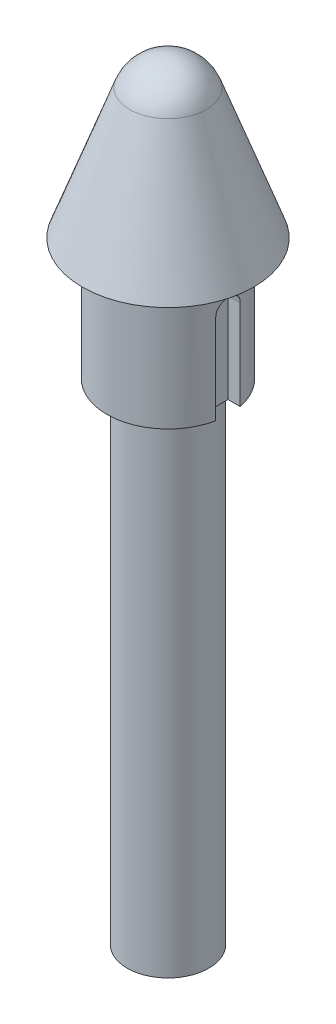
ISO-10303-21;
HEADER;
FILE_DESCRIPTION(('STEP AP214'),'2;1');
FILE_NAME('part.step','',(''),(''),'','','');
FILE_SCHEMA(('AUTOMOTIVE_DESIGN { 1 0 10303 214 1 1 1 1 }'));
ENDSEC;
DATA;
#1=APPLICATION_CONTEXT('core data for automotive mechanical design processes');
#2=APPLICATION_PROTOCOL_DEFINITION('international standard','automotive_design',2000,#1);
#3=PRODUCT_CONTEXT('',#1,'mechanical');
#4=PRODUCT('Part','Part','',(#3));
#5=PRODUCT_RELATED_PRODUCT_CATEGORY('part','',(#4));
#6=PRODUCT_DEFINITION_FORMATION('','',#4);
#7=PRODUCT_DEFINITION_CONTEXT('part definition',#1,'design');
#8=PRODUCT_DEFINITION('design','',#6,#7);
#9=PRODUCT_DEFINITION_SHAPE('','',#8);
#10=(LENGTH_UNIT() NAMED_UNIT(*) SI_UNIT(.MILLI.,.METRE.));
#11=(NAMED_UNIT(*) PLANE_ANGLE_UNIT() SI_UNIT($,.RADIAN.));
#12=(NAMED_UNIT(*) SI_UNIT($,.STERADIAN.) SOLID_ANGLE_UNIT());
#13=UNCERTAINTY_MEASURE_WITH_UNIT(LENGTH_MEASURE(1.E-05),#10,'distance_accuracy_value','');
#14=(GEOMETRIC_REPRESENTATION_CONTEXT(3) GLOBAL_UNCERTAINTY_ASSIGNED_CONTEXT((#13)) GLOBAL_UNIT_ASSIGNED_CONTEXT((#10,
#11,#12)) REPRESENTATION_CONTEXT('',''));
#15=CARTESIAN_POINT('',(0.,0.,0.));
#16=DIRECTION('',(0.,0.,1.));
#17=DIRECTION('',(1.,0.,0.));
#18=AXIS2_PLACEMENT_3D('',#15,#16,#17);
#19=CARTESIAN_POINT('',(0.,-55.,0.));
#20=DIRECTION('',(0.,-1.,0.));
#21=DIRECTION('',(0.,0.,-1.));
#22=AXIS2_PLACEMENT_3D('',#19,#20,#21);
#23=CYLINDRICAL_SURFACE('',#22,15.);
#24=CARTESIAN_POINT('',(14.6969384566991,-8.,3.));
#25=CARTESIAN_POINT('',(14.6969312234392,-7.91652066508534,3.00000906544191));
#26=CARTESIAN_POINT('',(14.6976495486021,-7.8330463350397,2.9965157041537));
#27=CARTESIAN_POINT('',(14.700483757429,-7.66671185235168,2.98259444138147));
#28=CARTESIAN_POINT('',(14.702599468061,-7.58385162495212,2.97216739846318));
#29=CARTESIAN_POINT('',(14.7081705090494,-7.41945853907751,2.94447095338817));
#30=CARTESIAN_POINT('',(14.7116237172869,-7.33792379002333,2.92721238940545));
#31=CARTESIAN_POINT('',(14.7197625010775,-7.17664875253507,2.88600576139186));
#32=CARTESIAN_POINT('',(14.7244480815889,-7.09690847132229,2.86205767044614));
#33=CARTESIAN_POINT('',(14.7401629599102,-6.86119639665705,2.78041602247391));
#34=CARTESIAN_POINT('',(14.7528550210328,-6.70860603613304,2.71290347005579));
#35=CARTESIAN_POINT('',(14.7812316708001,-6.41697632811339,2.55375802161833));
#36=CARTESIAN_POINT('',(14.7969166493193,-6.27793874964937,2.4621219825451));
#37=CARTESIAN_POINT('',(14.8297578363449,-6.0153317075264,2.2559454155559));
#38=CARTESIAN_POINT('',(14.8469300180427,-5.89197791009017,2.14113225771899));
#39=CARTESIAN_POINT('',(14.8806722679768,-5.66613761672948,1.89243469094566));
#40=CARTESIAN_POINT('',(14.8972422219552,-5.56365506380758,1.75854668648769));
#41=CARTESIAN_POINT('',(14.9280884957243,-5.38160918594931,1.47404497162895));
#42=CARTESIAN_POINT('',(14.9423429244798,-5.30225953850813,1.32329209339517));
#43=CARTESIAN_POINT('',(14.966758768645,-5.17014026330807,1.01029658203994));
#44=CARTESIAN_POINT('',(14.9769230545326,-5.11735198813824,0.848062101105301));
#45=CARTESIAN_POINT('',(14.98955535506,-5.05255559545008,0.570758604929492));
#46=CARTESIAN_POINT('',(14.9934509072789,-5.03287056601478,0.457488931874396));
#47=CARTESIAN_POINT('',(14.9986822110839,-5.00658841680157,0.229497779189883));
#48=CARTESIAN_POINT('',(15.0000204862012,-4.99997839432807,0.114777843364462));
#49=CARTESIAN_POINT('',(15.,-5.,0.));
#50=B_SPLINE_CURVE_WITH_KNOTS('',3,(#24,#25,#26,#27,#28,#29,#30,#31,#32,#33,#34,#35,#36,#37,#38,
#39,#40,#41,#42,#43,#44,#45,#46,#47,#48,#49),.UNSPECIFIED.,.F.,.F.,(4,2,2,2,2,2,2,2,2,2,2,2,4),
(0.,0.25035310738077,0.500675220464686,0.750601780324507,1.00052934576068,1.50000163080435,
1.999539024427,2.50533619405173,3.01122883058791,3.52165618091723,4.0317246839953,
4.37609006946685,4.72011545796362),.UNSPECIFIED.);
#51=CARTESIAN_POINT('',(14.6969384566991,-8.,3.));
#52=VERTEX_POINT('',#51);
#53=CARTESIAN_POINT('',(15.,-5.,0.));
#54=VERTEX_POINT('',#53);
#55=EDGE_CURVE('E45',#52,#54,#50,.T.);
#56=ORIENTED_EDGE('',*,*,#55,.T.);
#57=CARTESIAN_POINT('',(15.,-5.,0.));
#58=CARTESIAN_POINT('',(15.0000066839147,-4.99999097484375,-0.0834962437043639));
#59=CARTESIAN_POINT('',(14.9993029840755,-5.00348571142423,-0.166987576943416));
#60=CARTESIAN_POINT('',(14.996524313953,-5.01741274370686,-0.333357023806804));
#61=CARTESIAN_POINT('',(14.9944495062925,-5.02784421666549,-0.416235208976033));
#62=CARTESIAN_POINT('',(14.9889823330591,-5.05555331233057,-0.58066760305922));
#63=CARTESIAN_POINT('',(14.9855920132132,-5.07282030609371,-0.662223663834627));
#64=CARTESIAN_POINT('',(14.9775937585775,-5.11404787064147,-0.82354159535056));
#65=CARTESIAN_POINT('',(14.9729858204522,-5.13800845976239,-0.903303461175461));
#66=CARTESIAN_POINT('',(14.9575127234102,-5.21969545895455,-1.13908352103716));
#67=CARTESIAN_POINT('',(14.9449939021987,-5.28724805048632,-1.29171954615577));
#68=CARTESIAN_POINT('',(14.9169140352558,-5.44648708187603,-1.58342468587382));
#69=CARTESIAN_POINT('',(14.9013526392281,-5.53817630104242,-1.72249223554766));
#70=CARTESIAN_POINT('',(14.8686661547509,-5.7444070418772,-1.98506539980008));
#71=CARTESIAN_POINT('',(14.8515245643196,-5.85920921517265,-2.10836458648659));
#72=CARTESIAN_POINT('',(14.8177274041416,-6.10786227893127,-2.33409955733193));
#73=CARTESIAN_POINT('',(14.8010719330756,-6.2417170050376,-2.43653113032116));
#74=CARTESIAN_POINT('',(14.7699685399571,-6.52618833079427,-2.61852244163876));
#75=CARTESIAN_POINT('',(14.7555427056002,-6.67694990138056,-2.69785946156334));
#76=CARTESIAN_POINT('',(14.7307811722667,-6.9899628879115,-2.82995241342783));
#77=CARTESIAN_POINT('',(14.7204425461247,-7.15220598250986,-2.88272737593346));
#78=CARTESIAN_POINT('',(14.707584180765,-7.42947298813945,-2.9474871972406));
#79=CARTESIAN_POINT('',(14.703615100174,-7.54269449056358,-2.96715578638696));
#80=CARTESIAN_POINT('',(14.6982823799664,-7.77059222196287,-2.99341673810329));
#81=CARTESIAN_POINT('',(14.6969162316135,-7.88526694286319,-3.00002169179103));
#82=CARTESIAN_POINT('',(14.6969384566991,-8.,-3.));
#83=B_SPLINE_CURVE_WITH_KNOTS('',3,(#57,#58,#59,#60,#61,#62,#63,#64,#65,#66,#67,#68,#69,#70,#71,
#72,#73,#74,#75,#76,#77,#78,#79,#80,#81,#82),.UNSPECIFIED.,.F.,.F.,(4,2,2,2,2,2,2,2,2,2,2,2,4),
(0.,0.250404065586866,0.500778436866196,0.750765006342761,1.00075226063379,1.50035586182189,
2.00001701704666,2.505665088188,3.01141510031276,3.5218920779889,4.03200279849589,
4.37622496898429,4.72011520598592),.UNSPECIFIED.);
#84=CARTESIAN_POINT('',(14.6969384566991,-8.,-3.));
#85=VERTEX_POINT('',#84);
#86=EDGE_CURVE('E11',#54,#85,#83,.T.);
#87=ORIENTED_EDGE('',*,*,#86,.T.);
#88=DIRECTION('',(0.,-1.,0.));
#89=VECTOR('',#88,1.);
#90=CARTESIAN_POINT('',(14.6969384566991,-5.,-3.));
#91=LINE('',#90,#89);
#92=CARTESIAN_POINT('',(14.6969384566991,-30.,-3.));
#93=VERTEX_POINT('',#92);
#94=EDGE_CURVE('E108',#85,#93,#91,.T.);
#95=ORIENTED_EDGE('',*,*,#94,.T.);
#96=CARTESIAN_POINT('',(0.,-30.,0.));
#97=DIRECTION('',(0.,1.,0.));
#98=DIRECTION('',(0.,0.,1.));
#99=AXIS2_PLACEMENT_3D('',#96,#97,#98);
#100=CIRCLE('',#99,15.);
#101=CARTESIAN_POINT('',(14.6969384566991,-30.,3.));
#102=VERTEX_POINT('',#101);
#103=EDGE_CURVE('E110',#93,#102,#100,.T.);
#104=ORIENTED_EDGE('',*,*,#103,.T.);
#105=DIRECTION('',(0.,-1.,0.));
#106=VECTOR('',#105,1.);
#107=CARTESIAN_POINT('',(14.6969384566991,-5.,3.));
#108=LINE('',#107,#106);
#109=EDGE_CURVE('E92',#52,#102,#108,.T.);
#110=ORIENTED_EDGE('',*,*,#109,.F.);
#111=EDGE_LOOP('',(#56,#87,#95,#104,#110));
#112=FACE_BOUND('',#111,.T.);
#113=CARTESIAN_POINT('',(0.,0.,0.));
#114=DIRECTION('',(0.,-1.,0.));
#115=DIRECTION('',(0.,0.,-1.));
#116=AXIS2_PLACEMENT_3D('',#113,#114,#115);
#117=CIRCLE('',#116,15.);
#118=CARTESIAN_POINT('',(0.,0.,-15.));
#119=VERTEX_POINT('',#118);
#120=EDGE_CURVE('E120',#119,#119,#117,.T.);
#121=ORIENTED_EDGE('',*,*,#120,.T.);
#122=EDGE_LOOP('',(#121));
#123=FACE_BOUND('',#122,.T.);
#124=ADVANCED_FACE('F35',(#112,#123),#23,.T.);
#125=CARTESIAN_POINT('',(0.,28.4589818069161,0.));
#126=DIRECTION('',(0.,-1.,0.));
#127=DIRECTION('',(1.,0.,0.));
#128=AXIS2_PLACEMENT_3D('',#125,#126,#127);
#129=SPHERICAL_SURFACE('',#128,10.);
#130=CARTESIAN_POINT('',(0.,31.8791832401728,0.));
#131=DIRECTION('',(0.,-1.,0.));
#132=DIRECTION('',(0.,0.,-1.));
#133=AXIS2_PLACEMENT_3D('',#130,#131,#132);
#134=CIRCLE('',#133,9.39692620785908);
#135=CARTESIAN_POINT('',(0.,31.8791832401728,-9.39692620785908));
#136=VERTEX_POINT('',#135);
#137=EDGE_CURVE('E126',#136,#136,#134,.T.);
#138=ORIENTED_EDGE('',*,*,#137,.F.);
#139=EDGE_LOOP('',(#138));
#140=FACE_BOUND('',#139,.T.);
#141=ADVANCED_FACE('F150',(#140),#129,.T.);
#142=CARTESIAN_POINT('',(0.,0.,0.));
#143=DIRECTION('',(0.,-1.,0.));
#144=DIRECTION('',(0.,0.,-1.));
#145=AXIS2_PLACEMENT_3D('',#142,#143,#144);
#146=CONICAL_SURFACE('',#145,21.,0.349065850398867);
#147=ORIENTED_EDGE('',*,*,#137,.T.);
#148=EDGE_LOOP('',(#147));
#149=FACE_BOUND('',#148,.T.);
#150=CARTESIAN_POINT('',(0.,0.,0.));
#151=DIRECTION('',(0.,-1.,0.));
#152=DIRECTION('',(0.,0.,-1.));
#153=AXIS2_PLACEMENT_3D('',#150,#151,#152);
#154=CIRCLE('',#153,21.);
#155=CARTESIAN_POINT('',(0.,0.,-21.));
#156=VERTEX_POINT('',#155);
#157=EDGE_CURVE('E123',#156,#156,#154,.T.);
#158=ORIENTED_EDGE('',*,*,#157,.F.);
#159=EDGE_LOOP('',(#158));
#160=FACE_BOUND('',#159,.T.);
#161=ADVANCED_FACE('F158',(#149,#160),#146,.T.);
#162=CARTESIAN_POINT('',(15.,0.,0.));
#163=DIRECTION('',(0.,-1.,0.));
#164=DIRECTION('',(0.,0.,-1.));
#165=AXIS2_PLACEMENT_3D('',#162,#163,#164);
#166=PLANE('',#165);
#167=ORIENTED_EDGE('',*,*,#157,.T.);
#168=EDGE_LOOP('',(#167));
#169=FACE_BOUND('',#168,.T.);
#170=ORIENTED_EDGE('',*,*,#120,.F.);
#171=EDGE_LOOP('',(#170));
#172=FACE_BOUND('',#171,.T.);
#173=ADVANCED_FACE('F153',(#169,#172),#166,.T.);
#174=CARTESIAN_POINT('',(0.,9.42117093025151,0.));
#175=DIRECTION('',(0.,1.,0.));
#176=DIRECTION('',(0.,0.,1.));
#177=AXIS2_PLACEMENT_3D('',#174,#175,#176);
#178=CYLINDRICAL_SURFACE('',#177,10.);
#179=CARTESIAN_POINT('',(0.,-150.,0.));
#180=DIRECTION('',(0.,1.,0.));
#181=DIRECTION('',(0.,0.,1.));
#182=AXIS2_PLACEMENT_3D('',#179,#180,#181);
#183=CIRCLE('',#182,10.);
#184=CARTESIAN_POINT('',(0.,-150.,10.));
#185=VERTEX_POINT('',#184);
#186=EDGE_CURVE('E117',#185,#185,#183,.T.);
#187=ORIENTED_EDGE('',*,*,#186,.T.);
#188=EDGE_LOOP('',(#187));
#189=FACE_BOUND('',#188,.T.);
#190=CARTESIAN_POINT('',(0.,-30.,0.));
#191=DIRECTION('',(0.,1.,0.));
#192=DIRECTION('',(0.,0.,1.));
#193=AXIS2_PLACEMENT_3D('',#190,#191,#192);
#194=CIRCLE('',#193,10.);
#195=CARTESIAN_POINT('',(0.,-30.,10.));
#196=VERTEX_POINT('',#195);
#197=EDGE_CURVE('E114',#196,#196,#194,.T.);
#198=ORIENTED_EDGE('',*,*,#197,.F.);
#199=EDGE_LOOP('',(#198));
#200=FACE_BOUND('',#199,.T.);
#201=ADVANCED_FACE('F157',(#189,#200),#178,.T.);
#202=CARTESIAN_POINT('',(15.,-30.,0.));
#203=DIRECTION('',(0.,-1.,0.));
#204=DIRECTION('',(0.,0.,-1.));
#205=AXIS2_PLACEMENT_3D('',#202,#203,#204);
#206=PLANE('',#205);
#207=DIRECTION('',(1.,0.,0.));
#208=VECTOR('',#207,1.);
#209=CARTESIAN_POINT('',(11.6969384566991,-30.,-3.));
#210=LINE('',#209,#208);
#211=CARTESIAN_POINT('',(11.6969384566991,-30.,-3.));
#212=VERTEX_POINT('',#211);
#213=EDGE_CURVE('E104',#212,#93,#210,.T.);
#214=ORIENTED_EDGE('',*,*,#213,.F.);
#215=DIRECTION('',(0.,0.,-1.));
#216=VECTOR('',#215,1.);
#217=CARTESIAN_POINT('',(11.6969384566991,-30.,3.));
#218=LINE('',#217,#216);
#219=CARTESIAN_POINT('',(11.6969384566991,-30.,3.));
#220=VERTEX_POINT('',#219);
#221=EDGE_CURVE('E84',#220,#212,#218,.T.);
#222=ORIENTED_EDGE('',*,*,#221,.F.);
#223=DIRECTION('',(-1.,0.,0.));
#224=VECTOR('',#223,1.);
#225=CARTESIAN_POINT('',(14.6969384566991,-30.,3.));
#226=LINE('',#225,#224);
#227=EDGE_CURVE('E95',#102,#220,#226,.T.);
#228=ORIENTED_EDGE('',*,*,#227,.F.);
#229=ORIENTED_EDGE('',*,*,#103,.F.);
#230=EDGE_LOOP('',(#214,#222,#228,#229));
#231=FACE_BOUND('',#230,.T.);
#232=ORIENTED_EDGE('',*,*,#197,.T.);
#233=EDGE_LOOP('',(#232));
#234=FACE_BOUND('',#233,.T.);
#235=ADVANCED_FACE('F101',(#231,#234),#206,.T.);
#236=CARTESIAN_POINT('',(0.,-150.,0.));
#237=DIRECTION('',(0.,-1.,0.));
#238=DIRECTION('',(0.,0.,-1.));
#239=AXIS2_PLACEMENT_3D('',#236,#237,#238);
#240=PLANE('',#239);
#241=ORIENTED_EDGE('',*,*,#186,.F.);
#242=EDGE_LOOP('',(#241));
#243=FACE_BOUND('',#242,.T.);
#244=ADVANCED_FACE('F151',(#243),#240,.T.);
#245=CARTESIAN_POINT('',(11.6969384566991,-5.,-3.));
#246=DIRECTION('',(0.,0.,-1.));
#247=DIRECTION('',(-1.,0.,0.));
#248=AXIS2_PLACEMENT_3D('',#245,#246,#247);
#249=PLANE('',#248);
#250=ORIENTED_EDGE('',*,*,#94,.F.);
#251=DIRECTION('',(1.,0.,0.));
#252=VECTOR('',#251,1.);
#253=CARTESIAN_POINT('',(11.6969384566991,-8.,-3.));
#254=LINE('',#253,#252);
#255=CARTESIAN_POINT('',(11.6969384566991,-8.,-3.));
#256=VERTEX_POINT('',#255);
#257=EDGE_CURVE('E134',#85,#256,#254,.F.);
#258=ORIENTED_EDGE('',*,*,#257,.T.);
#259=DIRECTION('',(0.,-1.,0.));
#260=VECTOR('',#259,1.);
#261=CARTESIAN_POINT('',(11.6969384566991,-5.,-3.));
#262=LINE('',#261,#260);
#263=EDGE_CURVE('E91',#256,#212,#262,.T.);
#264=ORIENTED_EDGE('',*,*,#263,.T.);
#265=ORIENTED_EDGE('',*,*,#213,.T.);
#266=EDGE_LOOP('',(#250,#258,#264,#265));
#267=FACE_BOUND('',#266,.T.);
#268=ADVANCED_FACE('F188',(#267),#249,.F.);
#269=CARTESIAN_POINT('',(11.6969384566991,-5.,3.));
#270=DIRECTION('',(-1.,0.,0.));
#271=DIRECTION('',(0.,0.,1.));
#272=AXIS2_PLACEMENT_3D('',#269,#270,#271);
#273=PLANE('',#272);
#274=CARTESIAN_POINT('',(11.6969384566991,-8.,0.));
#275=DIRECTION('',(-1.,0.,0.));
#276=DIRECTION('',(0.,0.,1.));
#277=AXIS2_PLACEMENT_3D('',#274,#275,#276);
#278=CIRCLE('',#277,3.);
#279=CARTESIAN_POINT('',(11.6969384566991,-5.,0.));
#280=VERTEX_POINT('',#279);
#281=EDGE_CURVE('E129',#256,#280,#278,.F.);
#282=ORIENTED_EDGE('',*,*,#281,.T.);
#283=CARTESIAN_POINT('',(11.6969384566991,-8.,0.));
#284=DIRECTION('',(-1.,0.,0.));
#285=DIRECTION('',(0.,0.,1.));
#286=AXIS2_PLACEMENT_3D('',#283,#284,#285);
#287=CIRCLE('',#286,3.);
#288=CARTESIAN_POINT('',(11.6969384566991,-8.,3.));
#289=VERTEX_POINT('',#288);
#290=EDGE_CURVE('E87',#280,#289,#287,.F.);
#291=ORIENTED_EDGE('',*,*,#290,.T.);
#292=DIRECTION('',(0.,-1.,0.));
#293=VECTOR('',#292,1.);
#294=CARTESIAN_POINT('',(11.6969384566991,-5.,3.));
#295=LINE('',#294,#293);
#296=EDGE_CURVE('E79',#289,#220,#295,.T.);
#297=ORIENTED_EDGE('',*,*,#296,.T.);
#298=ORIENTED_EDGE('',*,*,#221,.T.);
#299=ORIENTED_EDGE('',*,*,#263,.F.);
#300=EDGE_LOOP('',(#282,#291,#297,#298,#299));
#301=FACE_BOUND('',#300,.T.);
#302=ADVANCED_FACE('F81',(#301),#273,.F.);
#303=CARTESIAN_POINT('',(14.6969384566991,-5.,3.));
#304=DIRECTION('',(0.,0.,1.));
#305=DIRECTION('',(1.,0.,0.));
#306=AXIS2_PLACEMENT_3D('',#303,#304,#305);
#307=PLANE('',#306);
#308=ORIENTED_EDGE('',*,*,#296,.F.);
#309=DIRECTION('',(-1.,0.,0.));
#310=VECTOR('',#309,1.);
#311=CARTESIAN_POINT('',(14.6969384566991,-8.,3.));
#312=LINE('',#311,#310);
#313=EDGE_CURVE('E132',#289,#52,#312,.F.);
#314=ORIENTED_EDGE('',*,*,#313,.T.);
#315=ORIENTED_EDGE('',*,*,#109,.T.);
#316=ORIENTED_EDGE('',*,*,#227,.T.);
#317=EDGE_LOOP('',(#308,#314,#315,#316));
#318=FACE_BOUND('',#317,.T.);
#319=ADVANCED_FACE('F96',(#318),#307,.F.);
#320=CARTESIAN_POINT('',(0.,-8.,0.));
#321=DIRECTION('',(-1.,0.,0.));
#322=DIRECTION('',(0.,0.,1.));
#323=AXIS2_PLACEMENT_3D('',#320,#321,#322);
#324=CYLINDRICAL_SURFACE('',#323,3.);
#325=ORIENTED_EDGE('',*,*,#257,.F.);
#326=ORIENTED_EDGE('',*,*,#86,.F.);
#327=DIRECTION('',(1.,0.,0.));
#328=VECTOR('',#327,1.);
#329=CARTESIAN_POINT('',(14.6969384566991,-5.,0.));
#330=LINE('',#329,#328);
#331=EDGE_CURVE('E40',#280,#54,#330,.T.);
#332=ORIENTED_EDGE('',*,*,#331,.F.);
#333=ORIENTED_EDGE('',*,*,#281,.F.);
#334=EDGE_LOOP('',(#325,#326,#332,#333));
#335=FACE_BOUND('',#334,.T.);
#336=ADVANCED_FACE('F37',(#335),#324,.F.);
#337=CARTESIAN_POINT('',(0.,-8.,0.));
#338=DIRECTION('',(1.,0.,0.));
#339=DIRECTION('',(0.,0.,-1.));
#340=AXIS2_PLACEMENT_3D('',#337,#338,#339);
#341=CYLINDRICAL_SURFACE('',#340,3.);
#342=ORIENTED_EDGE('',*,*,#55,.F.);
#343=ORIENTED_EDGE('',*,*,#313,.F.);
#344=ORIENTED_EDGE('',*,*,#290,.F.);
#345=ORIENTED_EDGE('',*,*,#331,.T.);
#346=EDGE_LOOP('',(#342,#343,#344,#345));
#347=FACE_BOUND('',#346,.T.);
#348=ADVANCED_FACE('F143',(#347),#341,.F.);
#349=CLOSED_SHELL('',(#124,#141,#161,#173,#201,#235,#244,#268,#302,#319,#336,#348));
#350=MANIFOLD_SOLID_BREP('B2',#349);
#351=ADVANCED_BREP_SHAPE_REPRESENTATION('',(#18,#350),#14);
#352=SHAPE_DEFINITION_REPRESENTATION(#9,#351);
ENDSEC;
END-ISO-10303-21;
